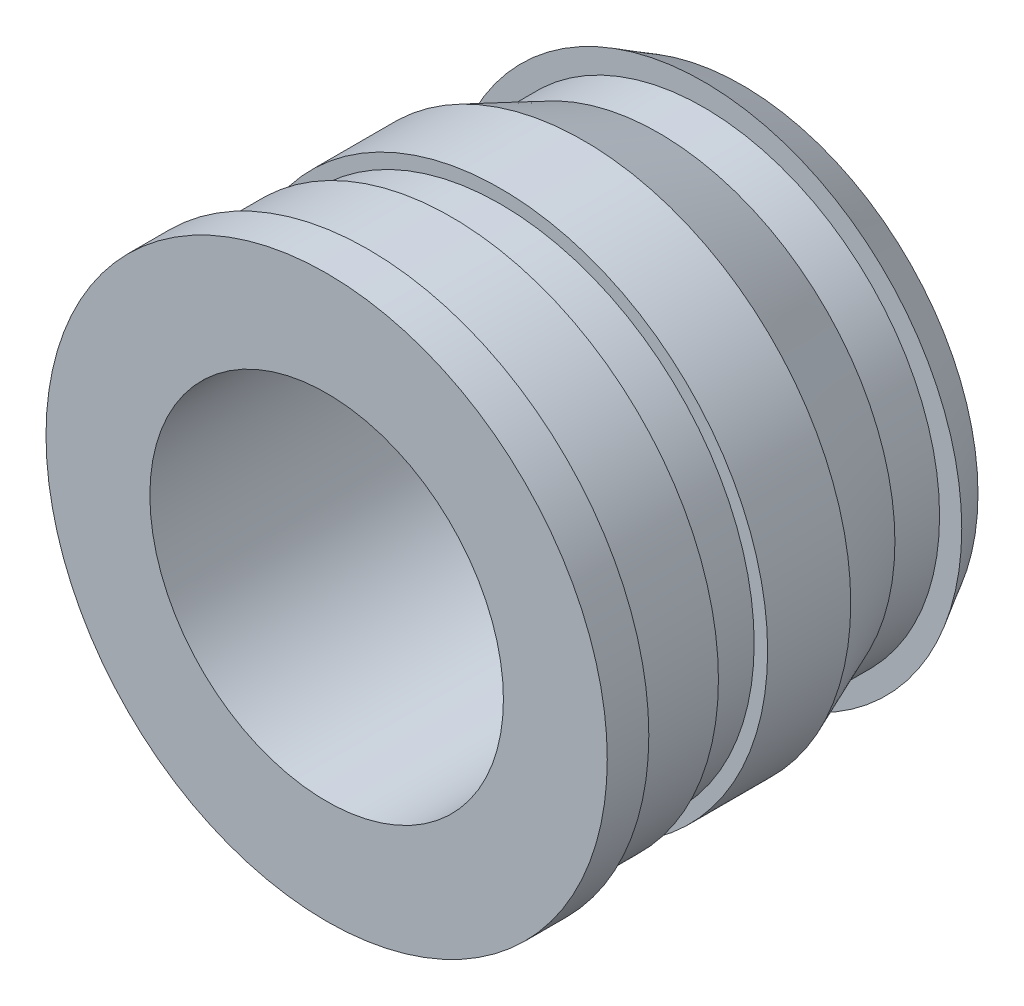
ISO-10303-21;
HEADER;
FILE_DESCRIPTION(('STEP AP214'),'2;1');
FILE_NAME('part.step','',(''),(''),'','','');
FILE_SCHEMA(('AUTOMOTIVE_DESIGN { 1 0 10303 214 1 1 1 1 }'));
ENDSEC;
DATA;
#1=APPLICATION_CONTEXT('core data for automotive mechanical design processes');
#2=APPLICATION_PROTOCOL_DEFINITION('international standard','automotive_design',2000,#1);
#3=PRODUCT_CONTEXT('',#1,'mechanical');
#4=PRODUCT('Part','Part','',(#3));
#5=PRODUCT_RELATED_PRODUCT_CATEGORY('part','',(#4));
#6=PRODUCT_DEFINITION_FORMATION('','',#4);
#7=PRODUCT_DEFINITION_CONTEXT('part definition',#1,'design');
#8=PRODUCT_DEFINITION('design','',#6,#7);
#9=PRODUCT_DEFINITION_SHAPE('','',#8);
#10=(LENGTH_UNIT() NAMED_UNIT(*) SI_UNIT(.MILLI.,.METRE.));
#11=(NAMED_UNIT(*) PLANE_ANGLE_UNIT() SI_UNIT($,.RADIAN.));
#12=(NAMED_UNIT(*) SI_UNIT($,.STERADIAN.) SOLID_ANGLE_UNIT());
#13=UNCERTAINTY_MEASURE_WITH_UNIT(LENGTH_MEASURE(1.E-05),#10,'distance_accuracy_value','');
#14=(GEOMETRIC_REPRESENTATION_CONTEXT(3) GLOBAL_UNCERTAINTY_ASSIGNED_CONTEXT((#13)) GLOBAL_UNIT_ASSIGNED_CONTEXT((#10,
#11,#12)) REPRESENTATION_CONTEXT('',''));
#15=CARTESIAN_POINT('',(0.,0.,0.));
#16=DIRECTION('',(0.,0.,1.));
#17=DIRECTION('',(1.,0.,0.));
#18=AXIS2_PLACEMENT_3D('',#15,#16,#17);
#19=CARTESIAN_POINT('',(0.,0.,2.35));
#20=DIRECTION('',(0.,0.,1.));
#21=DIRECTION('',(1.,0.,0.));
#22=AXIS2_PLACEMENT_3D('',#19,#20,#21);
#23=CYLINDRICAL_SURFACE('',#22,2.);
#24=CARTESIAN_POINT('',(0.,0.,-2.35));
#25=DIRECTION('',(0.,0.,1.));
#26=DIRECTION('',(1.,0.,0.));
#27=AXIS2_PLACEMENT_3D('',#24,#25,#26);
#28=CIRCLE('',#27,2.);
#29=CARTESIAN_POINT('',(2.,0.,-2.35));
#30=VERTEX_POINT('',#29);
#31=EDGE_CURVE('E78',#30,#30,#28,.T.);
#32=ORIENTED_EDGE('',*,*,#31,.F.);
#33=EDGE_LOOP('',(#32));
#34=FACE_BOUND('',#33,.T.);
#35=CARTESIAN_POINT('',(0.,0.,2.35));
#36=DIRECTION('',(0.,0.,1.));
#37=DIRECTION('',(1.,0.,0.));
#38=AXIS2_PLACEMENT_3D('',#35,#36,#37);
#39=CIRCLE('',#38,2.);
#40=CARTESIAN_POINT('',(2.,0.,2.35));
#41=VERTEX_POINT('',#40);
#42=EDGE_CURVE('E10',#41,#41,#39,.T.);
#43=ORIENTED_EDGE('',*,*,#42,.T.);
#44=EDGE_LOOP('',(#43));
#45=FACE_BOUND('',#44,.T.);
#46=ADVANCED_FACE('F32',(#34,#45),#23,.F.);
#47=CARTESIAN_POINT('',(0.,2.,2.35));
#48=DIRECTION('',(0.,0.,-1.));
#49=DIRECTION('',(-1.,0.,0.));
#50=AXIS2_PLACEMENT_3D('',#47,#48,#49);
#51=PLANE('',#50);
#52=ORIENTED_EDGE('',*,*,#42,.F.);
#53=EDGE_LOOP('',(#52));
#54=FACE_BOUND('',#53,.T.);
#55=CARTESIAN_POINT('',(0.,0.,2.35));
#56=DIRECTION('',(0.,0.,1.));
#57=DIRECTION('',(1.,0.,0.));
#58=AXIS2_PLACEMENT_3D('',#55,#56,#57);
#59=CIRCLE('',#58,3.175);
#60=CARTESIAN_POINT('',(3.175,0.,2.35));
#61=VERTEX_POINT('',#60);
#62=EDGE_CURVE('E38',#61,#61,#59,.T.);
#63=ORIENTED_EDGE('',*,*,#62,.T.);
#64=EDGE_LOOP('',(#63));
#65=FACE_BOUND('',#64,.T.);
#66=ADVANCED_FACE('F85',(#54,#65),#51,.F.);
#67=CARTESIAN_POINT('',(0.,0.,2.35));
#68=DIRECTION('',(0.,0.,1.));
#69=DIRECTION('',(1.,0.,0.));
#70=AXIS2_PLACEMENT_3D('',#67,#68,#69);
#71=CYLINDRICAL_SURFACE('',#70,3.175);
#72=ORIENTED_EDGE('',*,*,#62,.F.);
#73=EDGE_LOOP('',(#72));
#74=FACE_BOUND('',#73,.T.);
#75=CARTESIAN_POINT('',(0.,0.,1.88));
#76=DIRECTION('',(0.,0.,1.));
#77=DIRECTION('',(1.,0.,0.));
#78=AXIS2_PLACEMENT_3D('',#75,#76,#77);
#79=CIRCLE('',#78,3.175);
#80=CARTESIAN_POINT('',(3.175,0.,1.88));
#81=VERTEX_POINT('',#80);
#82=EDGE_CURVE('E42',#81,#81,#79,.T.);
#83=ORIENTED_EDGE('',*,*,#82,.T.);
#84=EDGE_LOOP('',(#83));
#85=FACE_BOUND('',#84,.T.);
#86=ADVANCED_FACE('F89',(#74,#85),#71,.T.);
#87=CARTESIAN_POINT('',(0.,3.175,1.88));
#88=DIRECTION('',(0.,0.,1.));
#89=DIRECTION('',(1.,0.,0.));
#90=AXIS2_PLACEMENT_3D('',#87,#88,#89);
#91=PLANE('',#90);
#92=ORIENTED_EDGE('',*,*,#82,.F.);
#93=EDGE_LOOP('',(#92));
#94=FACE_BOUND('',#93,.T.);
#95=CARTESIAN_POINT('',(0.,0.,1.88));
#96=DIRECTION('',(0.,0.,1.));
#97=DIRECTION('',(1.,0.,0.));
#98=AXIS2_PLACEMENT_3D('',#95,#96,#97);
#99=CIRCLE('',#98,3.0225);
#100=CARTESIAN_POINT('',(3.0225,0.,1.88));
#101=VERTEX_POINT('',#100);
#102=EDGE_CURVE('E46',#101,#101,#99,.T.);
#103=ORIENTED_EDGE('',*,*,#102,.T.);
#104=EDGE_LOOP('',(#103));
#105=FACE_BOUND('',#104,.T.);
#106=ADVANCED_FACE('F94',(#94,#105),#91,.F.);
#107=CARTESIAN_POINT('',(0.,0.,2.35));
#108=DIRECTION('',(0.,0.,1.));
#109=DIRECTION('',(1.,0.,0.));
#110=AXIS2_PLACEMENT_3D('',#107,#108,#109);
#111=CYLINDRICAL_SURFACE('',#110,3.0225);
#112=ORIENTED_EDGE('',*,*,#102,.F.);
#113=EDGE_LOOP('',(#112));
#114=FACE_BOUND('',#113,.T.);
#115=CARTESIAN_POINT('',(0.,0.,0.94));
#116=DIRECTION('',(0.,0.,1.));
#117=DIRECTION('',(1.,0.,0.));
#118=AXIS2_PLACEMENT_3D('',#115,#116,#117);
#119=CIRCLE('',#118,3.0225);
#120=CARTESIAN_POINT('',(3.0225,0.,0.94));
#121=VERTEX_POINT('',#120);
#122=EDGE_CURVE('E51',#121,#121,#119,.T.);
#123=ORIENTED_EDGE('',*,*,#122,.T.);
#124=EDGE_LOOP('',(#123));
#125=FACE_BOUND('',#124,.T.);
#126=ADVANCED_FACE('F100',(#114,#125),#111,.T.);
#127=CARTESIAN_POINT('',(0.,3.0225,0.94));
#128=DIRECTION('',(0.,0.,1.));
#129=DIRECTION('',(1.,0.,0.));
#130=AXIS2_PLACEMENT_3D('',#127,#128,#129);
#131=PLANE('',#130);
#132=ORIENTED_EDGE('',*,*,#122,.F.);
#133=EDGE_LOOP('',(#132));
#134=FACE_BOUND('',#133,.T.);
#135=CARTESIAN_POINT('',(0.,0.,0.94));
#136=DIRECTION('',(0.,0.,1.));
#137=DIRECTION('',(1.,0.,0.));
#138=AXIS2_PLACEMENT_3D('',#135,#136,#137);
#139=CIRCLE('',#138,2.87);
#140=CARTESIAN_POINT('',(2.87,0.,0.94));
#141=VERTEX_POINT('',#140);
#142=EDGE_CURVE('E54',#141,#141,#139,.T.);
#143=ORIENTED_EDGE('',*,*,#142,.T.);
#144=EDGE_LOOP('',(#143));
#145=FACE_BOUND('',#144,.T.);
#146=ADVANCED_FACE('F104',(#134,#145),#131,.F.);
#147=CARTESIAN_POINT('',(0.,0.,2.35));
#148=DIRECTION('',(0.,0.,1.));
#149=DIRECTION('',(1.,0.,0.));
#150=AXIS2_PLACEMENT_3D('',#147,#148,#149);
#151=CYLINDRICAL_SURFACE('',#150,2.87);
#152=ORIENTED_EDGE('',*,*,#142,.F.);
#153=EDGE_LOOP('',(#152));
#154=FACE_BOUND('',#153,.T.);
#155=CARTESIAN_POINT('',(0.,0.,0.38318307294265));
#156=DIRECTION('',(0.,0.,1.));
#157=DIRECTION('',(1.,0.,0.));
#158=AXIS2_PLACEMENT_3D('',#155,#156,#157);
#159=CIRCLE('',#158,2.87);
#160=CARTESIAN_POINT('',(2.87,0.,0.38318307294265));
#161=VERTEX_POINT('',#160);
#162=EDGE_CURVE('E57',#161,#161,#159,.T.);
#163=ORIENTED_EDGE('',*,*,#162,.T.);
#164=EDGE_LOOP('',(#163));
#165=FACE_BOUND('',#164,.T.);
#166=ADVANCED_FACE('F108',(#154,#165),#151,.T.);
#167=CARTESIAN_POINT('',(0.,2.87,0.38318307294265));
#168=DIRECTION('',(0.,0.,-1.));
#169=DIRECTION('',(-1.,0.,0.));
#170=AXIS2_PLACEMENT_3D('',#167,#168,#169);
#171=PLANE('',#170);
#172=ORIENTED_EDGE('',*,*,#162,.F.);
#173=EDGE_LOOP('',(#172));
#174=FACE_BOUND('',#173,.T.);
#175=CARTESIAN_POINT('',(0.,0.,0.38318307294265));
#176=DIRECTION('',(0.,0.,1.));
#177=DIRECTION('',(1.,0.,0.));
#178=AXIS2_PLACEMENT_3D('',#175,#176,#177);
#179=CIRCLE('',#178,3.0225);
#180=CARTESIAN_POINT('',(3.0225,0.,0.38318307294265));
#181=VERTEX_POINT('',#180);
#182=EDGE_CURVE('E60',#181,#181,#179,.T.);
#183=ORIENTED_EDGE('',*,*,#182,.T.);
#184=EDGE_LOOP('',(#183));
#185=FACE_BOUND('',#184,.T.);
#186=ADVANCED_FACE('F112',(#174,#185),#171,.F.);
#187=CARTESIAN_POINT('',(0.,0.,2.35));
#188=DIRECTION('',(0.,0.,1.));
#189=DIRECTION('',(1.,0.,0.));
#190=AXIS2_PLACEMENT_3D('',#187,#188,#189);
#191=CYLINDRICAL_SURFACE('',#190,3.0225);
#192=ORIENTED_EDGE('',*,*,#182,.F.);
#193=EDGE_LOOP('',(#192));
#194=FACE_BOUND('',#193,.T.);
#195=CARTESIAN_POINT('',(0.,0.,-0.55681692705735));
#196=DIRECTION('',(0.,0.,1.));
#197=DIRECTION('',(1.,0.,0.));
#198=AXIS2_PLACEMENT_3D('',#195,#196,#197);
#199=CIRCLE('',#198,3.0225);
#200=CARTESIAN_POINT('',(3.0225,0.,-0.55681692705735));
#201=VERTEX_POINT('',#200);
#202=EDGE_CURVE('E63',#201,#201,#199,.T.);
#203=ORIENTED_EDGE('',*,*,#202,.T.);
#204=EDGE_LOOP('',(#203));
#205=FACE_BOUND('',#204,.T.);
#206=ADVANCED_FACE('F116',(#194,#205),#191,.T.);
#207=CARTESIAN_POINT('',(0.,0.,-1.41));
#208=DIRECTION('',(0.,0.,1.));
#209=DIRECTION('',(1.,0.,0.));
#210=AXIS2_PLACEMENT_3D('',#207,#208,#209);
#211=CONICAL_SURFACE('',#210,2.6691,0.392699081698725);
#212=ORIENTED_EDGE('',*,*,#202,.F.);
#213=EDGE_LOOP('',(#212));
#214=FACE_BOUND('',#213,.T.);
#215=CARTESIAN_POINT('',(0.,0.,-1.41));
#216=DIRECTION('',(0.,0.,1.));
#217=DIRECTION('',(1.,0.,0.));
#218=AXIS2_PLACEMENT_3D('',#215,#216,#217);
#219=CIRCLE('',#218,2.6691);
#220=CARTESIAN_POINT('',(2.6691,0.,-1.41));
#221=VERTEX_POINT('',#220);
#222=EDGE_CURVE('E66',#221,#221,#219,.T.);
#223=ORIENTED_EDGE('',*,*,#222,.T.);
#224=EDGE_LOOP('',(#223));
#225=FACE_BOUND('',#224,.T.);
#226=ADVANCED_FACE('F120',(#214,#225),#211,.T.);
#227=CARTESIAN_POINT('',(0.,0.,2.35));
#228=DIRECTION('',(0.,0.,1.));
#229=DIRECTION('',(1.,0.,0.));
#230=AXIS2_PLACEMENT_3D('',#227,#228,#229);
#231=CYLINDRICAL_SURFACE('',#230,2.6691);
#232=ORIENTED_EDGE('',*,*,#222,.F.);
#233=EDGE_LOOP('',(#232));
#234=FACE_BOUND('',#233,.T.);
#235=CARTESIAN_POINT('',(0.,0.,-1.91542845238097));
#236=DIRECTION('',(0.,0.,1.));
#237=DIRECTION('',(1.,0.,0.));
#238=AXIS2_PLACEMENT_3D('',#235,#236,#237);
#239=CIRCLE('',#238,2.6691);
#240=CARTESIAN_POINT('',(2.6691,0.,-1.91542845238097));
#241=VERTEX_POINT('',#240);
#242=EDGE_CURVE('E69',#241,#241,#239,.T.);
#243=ORIENTED_EDGE('',*,*,#242,.T.);
#244=EDGE_LOOP('',(#243));
#245=FACE_BOUND('',#244,.T.);
#246=ADVANCED_FACE('F124',(#234,#245),#231,.T.);
#247=CARTESIAN_POINT('',(0.,2.6691,-1.91542845238097));
#248=DIRECTION('',(0.,0.,-1.));
#249=DIRECTION('',(-1.,0.,0.));
#250=AXIS2_PLACEMENT_3D('',#247,#248,#249);
#251=PLANE('',#250);
#252=ORIENTED_EDGE('',*,*,#242,.F.);
#253=EDGE_LOOP('',(#252));
#254=FACE_BOUND('',#253,.T.);
#255=CARTESIAN_POINT('',(0.,0.,-1.91542845238097));
#256=DIRECTION('',(0.,0.,1.));
#257=DIRECTION('',(1.,0.,0.));
#258=AXIS2_PLACEMENT_3D('',#255,#256,#257);
#259=CIRCLE('',#258,2.92);
#260=CARTESIAN_POINT('',(2.92,0.,-1.91542845238097));
#261=VERTEX_POINT('',#260);
#262=EDGE_CURVE('E72',#261,#261,#259,.T.);
#263=ORIENTED_EDGE('',*,*,#262,.T.);
#264=EDGE_LOOP('',(#263));
#265=FACE_BOUND('',#264,.T.);
#266=ADVANCED_FACE('F128',(#254,#265),#251,.F.);
#267=CARTESIAN_POINT('',(0.,0.,-2.35));
#268=DIRECTION('',(0.,0.,1.));
#269=DIRECTION('',(1.,0.,0.));
#270=AXIS2_PLACEMENT_3D('',#267,#268,#269);
#271=CONICAL_SURFACE('',#270,2.6691,0.5235987755983);
#272=ORIENTED_EDGE('',*,*,#262,.F.);
#273=EDGE_LOOP('',(#272));
#274=FACE_BOUND('',#273,.T.);
#275=CARTESIAN_POINT('',(0.,0.,-2.35));
#276=DIRECTION('',(0.,0.,1.));
#277=DIRECTION('',(1.,0.,0.));
#278=AXIS2_PLACEMENT_3D('',#275,#276,#277);
#279=CIRCLE('',#278,2.6691);
#280=CARTESIAN_POINT('',(2.6691,0.,-2.35));
#281=VERTEX_POINT('',#280);
#282=EDGE_CURVE('E75',#281,#281,#279,.T.);
#283=ORIENTED_EDGE('',*,*,#282,.T.);
#284=EDGE_LOOP('',(#283));
#285=FACE_BOUND('',#284,.T.);
#286=ADVANCED_FACE('F132',(#274,#285),#271,.T.);
#287=CARTESIAN_POINT('',(0.,2.6691,-2.35));
#288=DIRECTION('',(0.,0.,1.));
#289=DIRECTION('',(1.,0.,0.));
#290=AXIS2_PLACEMENT_3D('',#287,#288,#289);
#291=PLANE('',#290);
#292=ORIENTED_EDGE('',*,*,#282,.F.);
#293=EDGE_LOOP('',(#292));
#294=FACE_BOUND('',#293,.T.);
#295=ORIENTED_EDGE('',*,*,#31,.T.);
#296=EDGE_LOOP('',(#295));
#297=FACE_BOUND('',#296,.T.);
#298=ADVANCED_FACE('F82',(#294,#297),#291,.F.);
#299=CLOSED_SHELL('',(#46,#66,#86,#106,#126,#146,#166,#186,#206,#226,#246,#266,#286,#298));
#300=MANIFOLD_SOLID_BREP('B2',#299);
#301=ADVANCED_BREP_SHAPE_REPRESENTATION('',(#18,#300),#14);
#302=SHAPE_DEFINITION_REPRESENTATION(#9,#301);
ENDSEC;
END-ISO-10303-21;
